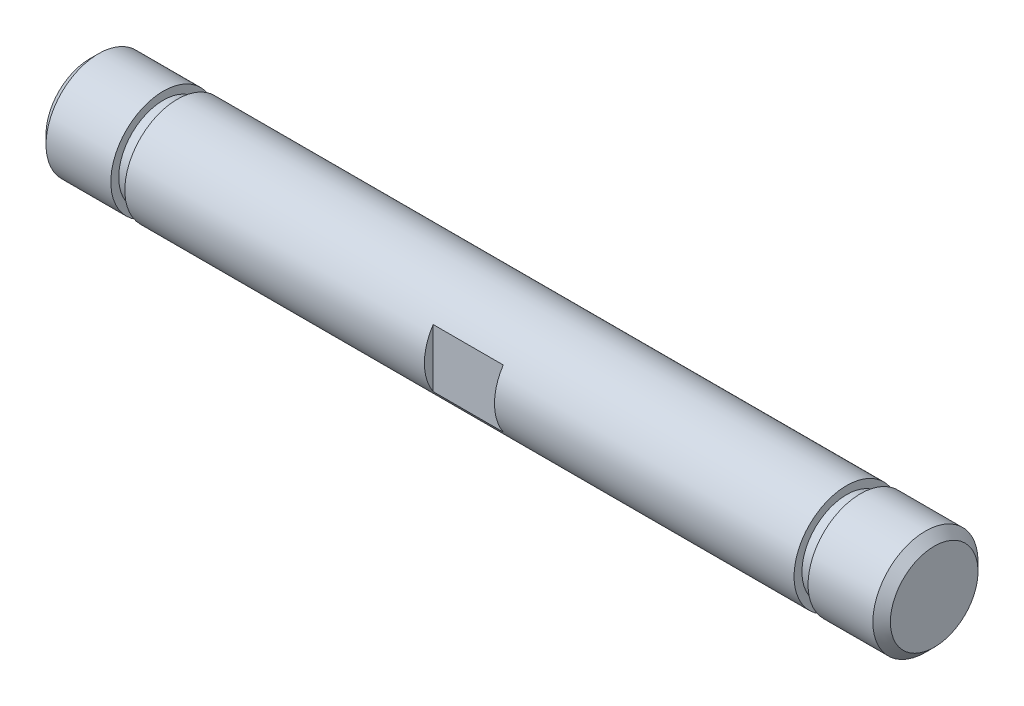
ISO-10303-21;
HEADER;
FILE_DESCRIPTION(('STEP AP214'),'2;1');
FILE_NAME('part.step','',(''),(''),'','','');
FILE_SCHEMA(('AUTOMOTIVE_DESIGN { 1 0 10303 214 1 1 1 1 }'));
ENDSEC;
DATA;
#1=APPLICATION_CONTEXT('core data for automotive mechanical design processes');
#2=APPLICATION_PROTOCOL_DEFINITION('international standard','automotive_design',2000,#1);
#3=PRODUCT_CONTEXT('',#1,'mechanical');
#4=PRODUCT('Part','Part','',(#3));
#5=PRODUCT_RELATED_PRODUCT_CATEGORY('part','',(#4));
#6=PRODUCT_DEFINITION_FORMATION('','',#4);
#7=PRODUCT_DEFINITION_CONTEXT('part definition',#1,'design');
#8=PRODUCT_DEFINITION('design','',#6,#7);
#9=PRODUCT_DEFINITION_SHAPE('','',#8);
#10=(LENGTH_UNIT() NAMED_UNIT(*) SI_UNIT(.MILLI.,.METRE.));
#11=(NAMED_UNIT(*) PLANE_ANGLE_UNIT() SI_UNIT($,.RADIAN.));
#12=(NAMED_UNIT(*) SI_UNIT($,.STERADIAN.) SOLID_ANGLE_UNIT());
#13=UNCERTAINTY_MEASURE_WITH_UNIT(LENGTH_MEASURE(1.E-05),#10,'distance_accuracy_value','');
#14=(GEOMETRIC_REPRESENTATION_CONTEXT(3) GLOBAL_UNCERTAINTY_ASSIGNED_CONTEXT((#13)) GLOBAL_UNIT_ASSIGNED_CONTEXT((#10,
#11,#12)) REPRESENTATION_CONTEXT('',''));
#15=CARTESIAN_POINT('',(0.,0.,0.));
#16=DIRECTION('',(0.,0.,1.));
#17=DIRECTION('',(1.,0.,0.));
#18=AXIS2_PLACEMENT_3D('',#15,#16,#17);
#19=CARTESIAN_POINT('',(24.1,0.,0.));
#20=DIRECTION('',(1.,0.,0.));
#21=DIRECTION('',(0.,0.,-1.));
#22=AXIS2_PLACEMENT_3D('',#19,#20,#21);
#23=CYLINDRICAL_SURFACE('',#22,3.);
#24=CARTESIAN_POINT('',(-19.1,0.,0.));
#25=DIRECTION('',(1.,0.,0.));
#26=DIRECTION('',(0.,0.,-1.));
#27=AXIS2_PLACEMENT_3D('',#24,#25,#26);
#28=CIRCLE('',#27,3.);
#29=CARTESIAN_POINT('',(-19.1,0.,-3.));
#30=VERTEX_POINT('',#29);
#31=EDGE_CURVE('E98',#30,#30,#28,.T.);
#32=ORIENTED_EDGE('',*,*,#31,.T.);
#33=EDGE_LOOP('',(#32));
#34=FACE_BOUND('',#33,.T.);
#35=CARTESIAN_POINT('',(19.1,0.,0.));
#36=DIRECTION('',(1.,0.,0.));
#37=DIRECTION('',(0.,0.,-1.));
#38=AXIS2_PLACEMENT_3D('',#35,#36,#37);
#39=CIRCLE('',#38,3.);
#40=CARTESIAN_POINT('',(19.1,0.,-3.));
#41=VERTEX_POINT('',#40);
#42=EDGE_CURVE('E95',#41,#41,#39,.T.);
#43=ORIENTED_EDGE('',*,*,#42,.F.);
#44=EDGE_LOOP('',(#43));
#45=FACE_BOUND('',#44,.T.);
#46=CARTESIAN_POINT('',(-2.,0.,0.));
#47=DIRECTION('',(1.,0.,0.));
#48=DIRECTION('',(0.,0.,-1.));
#49=AXIS2_PLACEMENT_3D('',#46,#47,#48);
#50=CIRCLE('',#49,3.);
#51=CARTESIAN_POINT('',(-2.,1.6583123951777,2.5));
#52=VERTEX_POINT('',#51);
#53=CARTESIAN_POINT('',(-2.,-1.6583123951777,2.5));
#54=VERTEX_POINT('',#53);
#55=EDGE_CURVE('E79',#52,#54,#50,.T.);
#56=ORIENTED_EDGE('',*,*,#55,.F.);
#57=DIRECTION('',(1.,0.,0.));
#58=VECTOR('',#57,1.);
#59=CARTESIAN_POINT('',(-2.,1.6583123951777,2.5));
#60=LINE('',#59,#58);
#61=CARTESIAN_POINT('',(2.,1.6583123951777,2.5));
#62=VERTEX_POINT('',#61);
#63=EDGE_CURVE('E66',#52,#62,#60,.T.);
#64=ORIENTED_EDGE('',*,*,#63,.T.);
#65=CARTESIAN_POINT('',(2.,0.,0.));
#66=DIRECTION('',(1.,0.,0.));
#67=DIRECTION('',(0.,0.,-1.));
#68=AXIS2_PLACEMENT_3D('',#65,#66,#67);
#69=CIRCLE('',#68,3.);
#70=CARTESIAN_POINT('',(2.,-1.6583123951777,2.5));
#71=VERTEX_POINT('',#70);
#72=EDGE_CURVE('E72',#62,#71,#69,.T.);
#73=ORIENTED_EDGE('',*,*,#72,.T.);
#74=DIRECTION('',(1.,0.,0.));
#75=VECTOR('',#74,1.);
#76=CARTESIAN_POINT('',(-2.,-1.6583123951777,2.5));
#77=LINE('',#76,#75);
#78=EDGE_CURVE('E78',#54,#71,#77,.T.);
#79=ORIENTED_EDGE('',*,*,#78,.F.);
#80=EDGE_LOOP('',(#56,#64,#73,#79));
#81=FACE_BOUND('',#80,.T.);
#82=ADVANCED_FACE('F43',(#34,#45,#81),#23,.T.);
#83=CARTESIAN_POINT('',(24.1,0.,3.));
#84=DIRECTION('',(-1.,0.,0.));
#85=DIRECTION('',(0.,0.,1.));
#86=AXIS2_PLACEMENT_3D('',#83,#84,#85);
#87=PLANE('',#86);
#88=CARTESIAN_POINT('',(24.1,0.,0.));
#89=DIRECTION('',(-1.,0.,0.));
#90=DIRECTION('',(0.,0.,1.));
#91=AXIS2_PLACEMENT_3D('',#88,#89,#90);
#92=CIRCLE('',#91,2.49999999999999);
#93=CARTESIAN_POINT('',(24.1,0.,2.49999999999999));
#94=VERTEX_POINT('',#93);
#95=EDGE_CURVE('E52',#94,#94,#92,.F.);
#96=ORIENTED_EDGE('',*,*,#95,.T.);
#97=EDGE_LOOP('',(#96));
#98=FACE_BOUND('',#97,.T.);
#99=ADVANCED_FACE('F118',(#98),#87,.F.);
#100=CARTESIAN_POINT('',(-24.1,0.,3.));
#101=DIRECTION('',(1.,0.,0.));
#102=DIRECTION('',(0.,0.,-1.));
#103=AXIS2_PLACEMENT_3D('',#100,#101,#102);
#104=PLANE('',#103);
#105=CARTESIAN_POINT('',(-24.1,0.,0.));
#106=DIRECTION('',(1.,0.,0.));
#107=DIRECTION('',(0.,0.,-1.));
#108=AXIS2_PLACEMENT_3D('',#105,#106,#107);
#109=CIRCLE('',#108,2.5);
#110=CARTESIAN_POINT('',(-24.1,0.,-2.5));
#111=VERTEX_POINT('',#110);
#112=EDGE_CURVE('E113',#111,#111,#109,.F.);
#113=ORIENTED_EDGE('',*,*,#112,.T.);
#114=EDGE_LOOP('',(#113));
#115=FACE_BOUND('',#114,.T.);
#116=ADVANCED_FACE('F134',(#115),#104,.F.);
#117=CARTESIAN_POINT('',(24.1,0.,0.));
#118=DIRECTION('',(1.,0.,0.));
#119=DIRECTION('',(0.,0.,-1.));
#120=AXIS2_PLACEMENT_3D('',#117,#118,#119);
#121=CYLINDRICAL_SURFACE('',#120,3.);
#122=CARTESIAN_POINT('',(-23.6,0.,0.));
#123=DIRECTION('',(1.,0.,0.));
#124=DIRECTION('',(0.,0.,-1.));
#125=AXIS2_PLACEMENT_3D('',#122,#123,#124);
#126=CIRCLE('',#125,3.);
#127=CARTESIAN_POINT('',(-23.6,0.,-3.));
#128=VERTEX_POINT('',#127);
#129=EDGE_CURVE('E110',#128,#128,#126,.T.);
#130=ORIENTED_EDGE('',*,*,#129,.T.);
#131=EDGE_LOOP('',(#130));
#132=FACE_BOUND('',#131,.T.);
#133=CARTESIAN_POINT('',(-19.9,0.,0.));
#134=DIRECTION('',(1.,0.,0.));
#135=DIRECTION('',(0.,0.,-1.));
#136=AXIS2_PLACEMENT_3D('',#133,#134,#135);
#137=CIRCLE('',#136,3.);
#138=CARTESIAN_POINT('',(-19.9,0.,-3.));
#139=VERTEX_POINT('',#138);
#140=EDGE_CURVE('E107',#139,#139,#137,.T.);
#141=ORIENTED_EDGE('',*,*,#140,.F.);
#142=EDGE_LOOP('',(#141));
#143=FACE_BOUND('',#142,.T.);
#144=ADVANCED_FACE('F152',(#132,#143),#121,.T.);
#145=CARTESIAN_POINT('',(-19.9,0.,2.55));
#146=DIRECTION('',(-1.,0.,0.));
#147=DIRECTION('',(0.,0.,1.));
#148=AXIS2_PLACEMENT_3D('',#145,#146,#147);
#149=PLANE('',#148);
#150=CARTESIAN_POINT('',(-19.9,0.,0.));
#151=DIRECTION('',(1.,0.,0.));
#152=DIRECTION('',(0.,0.,-1.));
#153=AXIS2_PLACEMENT_3D('',#150,#151,#152);
#154=CIRCLE('',#153,2.55);
#155=CARTESIAN_POINT('',(-19.9,0.,-2.55));
#156=VERTEX_POINT('',#155);
#157=EDGE_CURVE('E104',#156,#156,#154,.T.);
#158=ORIENTED_EDGE('',*,*,#157,.F.);
#159=EDGE_LOOP('',(#158));
#160=FACE_BOUND('',#159,.T.);
#161=ORIENTED_EDGE('',*,*,#140,.T.);
#162=EDGE_LOOP('',(#161));
#163=FACE_BOUND('',#162,.T.);
#164=ADVANCED_FACE('F148',(#160,#163),#149,.F.);
#165=CARTESIAN_POINT('',(24.1,0.,0.));
#166=DIRECTION('',(1.,0.,0.));
#167=DIRECTION('',(0.,0.,-1.));
#168=AXIS2_PLACEMENT_3D('',#165,#166,#167);
#169=CYLINDRICAL_SURFACE('',#168,2.55);
#170=CARTESIAN_POINT('',(-19.1,0.,0.));
#171=DIRECTION('',(1.,0.,0.));
#172=DIRECTION('',(0.,0.,-1.));
#173=AXIS2_PLACEMENT_3D('',#170,#171,#172);
#174=CIRCLE('',#173,2.55);
#175=CARTESIAN_POINT('',(-19.1,0.,-2.55));
#176=VERTEX_POINT('',#175);
#177=EDGE_CURVE('E101',#176,#176,#174,.T.);
#178=ORIENTED_EDGE('',*,*,#177,.F.);
#179=EDGE_LOOP('',(#178));
#180=FACE_BOUND('',#179,.T.);
#181=ORIENTED_EDGE('',*,*,#157,.T.);
#182=EDGE_LOOP('',(#181));
#183=FACE_BOUND('',#182,.T.);
#184=ADVANCED_FACE('F144',(#180,#183),#169,.T.);
#185=CARTESIAN_POINT('',(-19.1,0.,3.));
#186=DIRECTION('',(1.,0.,0.));
#187=DIRECTION('',(0.,0.,-1.));
#188=AXIS2_PLACEMENT_3D('',#185,#186,#187);
#189=PLANE('',#188);
#190=ORIENTED_EDGE('',*,*,#31,.F.);
#191=EDGE_LOOP('',(#190));
#192=FACE_BOUND('',#191,.T.);
#193=ORIENTED_EDGE('',*,*,#177,.T.);
#194=EDGE_LOOP('',(#193));
#195=FACE_BOUND('',#194,.T.);
#196=ADVANCED_FACE('F141',(#192,#195),#189,.F.);
#197=CARTESIAN_POINT('',(19.1,0.,3.));
#198=DIRECTION('',(-1.,0.,0.));
#199=DIRECTION('',(0.,0.,1.));
#200=AXIS2_PLACEMENT_3D('',#197,#198,#199);
#201=PLANE('',#200);
#202=CARTESIAN_POINT('',(19.1,0.,0.));
#203=DIRECTION('',(1.,0.,0.));
#204=DIRECTION('',(0.,0.,-1.));
#205=AXIS2_PLACEMENT_3D('',#202,#203,#204);
#206=CIRCLE('',#205,2.55);
#207=CARTESIAN_POINT('',(19.1,0.,-2.55));
#208=VERTEX_POINT('',#207);
#209=EDGE_CURVE('E92',#208,#208,#206,.T.);
#210=ORIENTED_EDGE('',*,*,#209,.F.);
#211=EDGE_LOOP('',(#210));
#212=FACE_BOUND('',#211,.T.);
#213=ORIENTED_EDGE('',*,*,#42,.T.);
#214=EDGE_LOOP('',(#213));
#215=FACE_BOUND('',#214,.T.);
#216=ADVANCED_FACE('F139',(#212,#215),#201,.F.);
#217=CARTESIAN_POINT('',(24.1,0.,0.));
#218=DIRECTION('',(1.,0.,0.));
#219=DIRECTION('',(0.,0.,-1.));
#220=AXIS2_PLACEMENT_3D('',#217,#218,#219);
#221=CYLINDRICAL_SURFACE('',#220,2.55);
#222=CARTESIAN_POINT('',(19.9,0.,0.));
#223=DIRECTION('',(1.,0.,0.));
#224=DIRECTION('',(0.,0.,-1.));
#225=AXIS2_PLACEMENT_3D('',#222,#223,#224);
#226=CIRCLE('',#225,2.55);
#227=CARTESIAN_POINT('',(19.9,0.,-2.55));
#228=VERTEX_POINT('',#227);
#229=EDGE_CURVE('E85',#228,#228,#226,.T.);
#230=ORIENTED_EDGE('',*,*,#229,.F.);
#231=EDGE_LOOP('',(#230));
#232=FACE_BOUND('',#231,.T.);
#233=ORIENTED_EDGE('',*,*,#209,.T.);
#234=EDGE_LOOP('',(#233));
#235=FACE_BOUND('',#234,.T.);
#236=ADVANCED_FACE('F241',(#232,#235),#221,.T.);
#237=CARTESIAN_POINT('',(19.9,0.,2.55));
#238=DIRECTION('',(1.,0.,0.));
#239=DIRECTION('',(0.,0.,-1.));
#240=AXIS2_PLACEMENT_3D('',#237,#238,#239);
#241=PLANE('',#240);
#242=CARTESIAN_POINT('',(19.9,0.,0.));
#243=DIRECTION('',(1.,0.,0.));
#244=DIRECTION('',(0.,0.,-1.));
#245=AXIS2_PLACEMENT_3D('',#242,#243,#244);
#246=CIRCLE('',#245,3.);
#247=CARTESIAN_POINT('',(19.9,0.,-3.));
#248=VERTEX_POINT('',#247);
#249=EDGE_CURVE('E82',#248,#248,#246,.T.);
#250=ORIENTED_EDGE('',*,*,#249,.F.);
#251=EDGE_LOOP('',(#250));
#252=FACE_BOUND('',#251,.T.);
#253=ORIENTED_EDGE('',*,*,#229,.T.);
#254=EDGE_LOOP('',(#253));
#255=FACE_BOUND('',#254,.T.);
#256=ADVANCED_FACE('F188',(#252,#255),#241,.F.);
#257=CARTESIAN_POINT('',(24.1,0.,0.));
#258=DIRECTION('',(1.,0.,0.));
#259=DIRECTION('',(0.,0.,-1.));
#260=AXIS2_PLACEMENT_3D('',#257,#258,#259);
#261=CYLINDRICAL_SURFACE('',#260,3.);
#262=CARTESIAN_POINT('',(23.6,0.,0.));
#263=DIRECTION('',(-1.,0.,0.));
#264=DIRECTION('',(0.,0.,1.));
#265=AXIS2_PLACEMENT_3D('',#262,#263,#264);
#266=CIRCLE('',#265,3.);
#267=CARTESIAN_POINT('',(23.6,0.,3.));
#268=VERTEX_POINT('',#267);
#269=EDGE_CURVE('E11',#268,#268,#266,.T.);
#270=ORIENTED_EDGE('',*,*,#269,.T.);
#271=EDGE_LOOP('',(#270));
#272=FACE_BOUND('',#271,.T.);
#273=ORIENTED_EDGE('',*,*,#249,.T.);
#274=EDGE_LOOP('',(#273));
#275=FACE_BOUND('',#274,.T.);
#276=ADVANCED_FACE('F185',(#272,#275),#261,.T.);
#277=CARTESIAN_POINT('',(-2.,1.6583123951777,2.5));
#278=DIRECTION('',(0.,0.,-1.));
#279=DIRECTION('',(-1.,0.,0.));
#280=AXIS2_PLACEMENT_3D('',#277,#278,#279);
#281=PLANE('',#280);
#282=DIRECTION('',(0.,1.,0.));
#283=VECTOR('',#282,1.);
#284=CARTESIAN_POINT('',(2.,1.6583123951777,2.5));
#285=LINE('',#284,#283);
#286=EDGE_CURVE('E58',#71,#62,#285,.T.);
#287=ORIENTED_EDGE('',*,*,#286,.T.);
#288=ORIENTED_EDGE('',*,*,#63,.F.);
#289=DIRECTION('',(0.,1.,0.));
#290=VECTOR('',#289,1.);
#291=CARTESIAN_POINT('',(-2.,1.6583123951777,2.5));
#292=LINE('',#291,#290);
#293=EDGE_CURVE('E87',#54,#52,#292,.T.);
#294=ORIENTED_EDGE('',*,*,#293,.F.);
#295=ORIENTED_EDGE('',*,*,#78,.T.);
#296=EDGE_LOOP('',(#287,#288,#294,#295));
#297=FACE_BOUND('',#296,.T.);
#298=ADVANCED_FACE('F77',(#297),#281,.F.);
#299=CARTESIAN_POINT('',(-2.,0.,0.));
#300=DIRECTION('',(1.,0.,0.));
#301=DIRECTION('',(0.,0.,-1.));
#302=AXIS2_PLACEMENT_3D('',#299,#300,#301);
#303=PLANE('',#302);
#304=ORIENTED_EDGE('',*,*,#55,.T.);
#305=ORIENTED_EDGE('',*,*,#293,.T.);
#306=EDGE_LOOP('',(#304,#305));
#307=FACE_BOUND('',#306,.T.);
#308=ADVANCED_FACE('F211',(#307),#303,.T.);
#309=CARTESIAN_POINT('',(2.,0.,0.));
#310=DIRECTION('',(1.,0.,0.));
#311=DIRECTION('',(0.,0.,-1.));
#312=AXIS2_PLACEMENT_3D('',#309,#310,#311);
#313=PLANE('',#312);
#314=ORIENTED_EDGE('',*,*,#72,.F.);
#315=ORIENTED_EDGE('',*,*,#286,.F.);
#316=EDGE_LOOP('',(#314,#315));
#317=FACE_BOUND('',#316,.T.);
#318=ADVANCED_FACE('F73',(#317),#313,.F.);
#319=CARTESIAN_POINT('',(-23.6,0.,0.));
#320=DIRECTION('',(1.,0.,0.));
#321=DIRECTION('',(0.,0.,-1.));
#322=AXIS2_PLACEMENT_3D('',#319,#320,#321);
#323=CONICAL_SURFACE('',#322,3.,0.785398163397453);
#324=ORIENTED_EDGE('',*,*,#112,.F.);
#325=EDGE_LOOP('',(#324));
#326=FACE_BOUND('',#325,.T.);
#327=ORIENTED_EDGE('',*,*,#129,.F.);
#328=EDGE_LOOP('',(#327));
#329=FACE_BOUND('',#328,.T.);
#330=ADVANCED_FACE('F121',(#326,#329),#323,.T.);
#331=CARTESIAN_POINT('',(24.1,0.,0.));
#332=DIRECTION('',(-1.,0.,0.));
#333=DIRECTION('',(0.,0.,1.));
#334=AXIS2_PLACEMENT_3D('',#331,#332,#333);
#335=CONICAL_SURFACE('',#334,2.49999999999999,0.785398163397453);
#336=ORIENTED_EDGE('',*,*,#269,.F.);
#337=EDGE_LOOP('',(#336));
#338=FACE_BOUND('',#337,.T.);
#339=ORIENTED_EDGE('',*,*,#95,.F.);
#340=EDGE_LOOP('',(#339));
#341=FACE_BOUND('',#340,.T.);
#342=ADVANCED_FACE('F46',(#338,#341),#335,.T.);
#343=CLOSED_SHELL('',(#82,#99,#116,#144,#164,#184,#196,#216,#236,#256,#276,#298,#308,#318,#330,#342));
#344=MANIFOLD_SOLID_BREP('B2',#343);
#345=ADVANCED_BREP_SHAPE_REPRESENTATION('',(#18,#344),#14);
#346=SHAPE_DEFINITION_REPRESENTATION(#9,#345);
ENDSEC;
END-ISO-10303-21;
